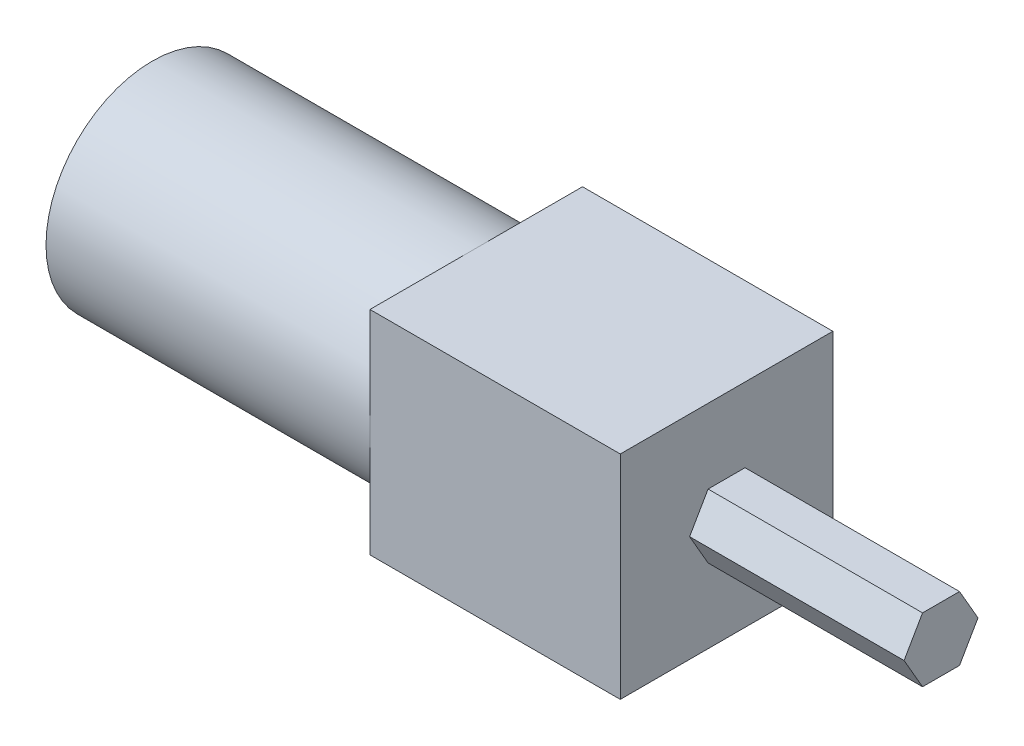
ISO-10303-21;
HEADER;
FILE_DESCRIPTION(('STEP AP214'),'2;1');
FILE_NAME('part.step','',(''),(''),'','','');
FILE_SCHEMA(('AUTOMOTIVE_DESIGN { 1 0 10303 214 1 1 1 1 }'));
ENDSEC;
DATA;
#1=APPLICATION_CONTEXT('core data for automotive mechanical design processes');
#2=APPLICATION_PROTOCOL_DEFINITION('international standard','automotive_design',2000,#1);
#3=PRODUCT_CONTEXT('',#1,'mechanical');
#4=PRODUCT('Part','Part','',(#3));
#5=PRODUCT_RELATED_PRODUCT_CATEGORY('part','',(#4));
#6=PRODUCT_DEFINITION_FORMATION('','',#4);
#7=PRODUCT_DEFINITION_CONTEXT('part definition',#1,'design');
#8=PRODUCT_DEFINITION('design','',#6,#7);
#9=PRODUCT_DEFINITION_SHAPE('','',#8);
#10=(LENGTH_UNIT() NAMED_UNIT(*) SI_UNIT(.MILLI.,.METRE.));
#11=(NAMED_UNIT(*) PLANE_ANGLE_UNIT() SI_UNIT($,.RADIAN.));
#12=(NAMED_UNIT(*) SI_UNIT($,.STERADIAN.) SOLID_ANGLE_UNIT());
#13=UNCERTAINTY_MEASURE_WITH_UNIT(LENGTH_MEASURE(1.E-05),#10,'distance_accuracy_value','');
#14=(GEOMETRIC_REPRESENTATION_CONTEXT(3) GLOBAL_UNCERTAINTY_ASSIGNED_CONTEXT((#13)) GLOBAL_UNIT_ASSIGNED_CONTEXT((#10,
#11,#12)) REPRESENTATION_CONTEXT('',''));
#15=CARTESIAN_POINT('',(0.,0.,0.));
#16=DIRECTION('',(0.,0.,1.));
#17=DIRECTION('',(1.,0.,0.));
#18=AXIS2_PLACEMENT_3D('',#15,#16,#17);
#19=CARTESIAN_POINT('',(113.919,0.,0.));
#20=DIRECTION('',(-1.,0.,0.));
#21=DIRECTION('',(0.,0.,1.));
#22=AXIS2_PLACEMENT_3D('',#19,#20,#21);
#23=PLANE('',#22);
#24=DIRECTION('',(0.,1.,0.));
#25=VECTOR('',#24,1.);
#26=CARTESIAN_POINT('',(113.919,-21.082,-21.082));
#27=LINE('',#26,#25);
#28=CARTESIAN_POINT('',(113.919,-21.082,-21.082));
#29=VERTEX_POINT('',#28);
#30=CARTESIAN_POINT('',(113.919,21.082,-21.082));
#31=VERTEX_POINT('',#30);
#32=EDGE_CURVE('E153',#29,#31,#27,.T.);
#33=ORIENTED_EDGE('',*,*,#32,.T.);
#34=DIRECTION('',(0.,0.,1.));
#35=VECTOR('',#34,1.);
#36=CARTESIAN_POINT('',(113.919,21.082,21.082));
#37=LINE('',#36,#35);
#38=CARTESIAN_POINT('',(113.919,21.082,21.082));
#39=VERTEX_POINT('',#38);
#40=EDGE_CURVE('E156',#31,#39,#37,.T.);
#41=ORIENTED_EDGE('',*,*,#40,.T.);
#42=DIRECTION('',(0.,-1.,0.));
#43=VECTOR('',#42,1.);
#44=CARTESIAN_POINT('',(113.919,-21.082,21.082));
#45=LINE('',#44,#43);
#46=CARTESIAN_POINT('',(113.919,-21.082,21.082));
#47=VERTEX_POINT('',#46);
#48=EDGE_CURVE('E159',#39,#47,#45,.T.);
#49=ORIENTED_EDGE('',*,*,#48,.T.);
#50=DIRECTION('',(0.,0.,-1.));
#51=VECTOR('',#50,1.);
#52=CARTESIAN_POINT('',(113.919,-21.082,21.082));
#53=LINE('',#52,#51);
#54=EDGE_CURVE('E161',#47,#29,#53,.T.);
#55=ORIENTED_EDGE('',*,*,#54,.T.);
#56=EDGE_LOOP('',(#33,#41,#49,#55));
#57=FACE_BOUND('',#56,.T.);
#58=DIRECTION('',(0.,0.866025403784439,-0.5));
#59=VECTOR('',#58,1.);
#60=CARTESIAN_POINT('',(113.919,-6.35,-3.66617420935412));
#61=LINE('',#60,#59);
#62=CARTESIAN_POINT('',(113.919,-6.35,-3.66617420935412));
#63=VERTEX_POINT('',#62);
#64=CARTESIAN_POINT('',(113.919,0.,-7.33234841870825));
#65=VERTEX_POINT('',#64);
#66=EDGE_CURVE('E144',#63,#65,#61,.T.);
#67=ORIENTED_EDGE('',*,*,#66,.F.);
#68=DIRECTION('',(0.,0.,-1.));
#69=VECTOR('',#68,1.);
#70=CARTESIAN_POINT('',(113.919,-6.35,3.66617420935412));
#71=LINE('',#70,#69);
#72=CARTESIAN_POINT('',(113.919,-6.35,3.66617420935412));
#73=VERTEX_POINT('',#72);
#74=EDGE_CURVE('E141',#73,#63,#71,.T.);
#75=ORIENTED_EDGE('',*,*,#74,.F.);
#76=DIRECTION('',(0.,-0.866025403784438,-0.5));
#77=VECTOR('',#76,1.);
#78=CARTESIAN_POINT('',(113.919,0.,7.33234841870825));
#79=LINE('',#78,#77);
#80=CARTESIAN_POINT('',(113.919,0.,7.33234841870825));
#81=VERTEX_POINT('',#80);
#82=EDGE_CURVE('E381',#81,#73,#79,.T.);
#83=ORIENTED_EDGE('',*,*,#82,.F.);
#84=DIRECTION('',(0.,-0.866025403784439,0.5));
#85=VECTOR('',#84,1.);
#86=CARTESIAN_POINT('',(113.919,6.35,3.66617420935412));
#87=LINE('',#86,#85);
#88=CARTESIAN_POINT('',(113.919,6.35,3.66617420935412));
#89=VERTEX_POINT('',#88);
#90=EDGE_CURVE('E396',#89,#81,#87,.T.);
#91=ORIENTED_EDGE('',*,*,#90,.F.);
#92=DIRECTION('',(0.,0.,1.));
#93=VECTOR('',#92,1.);
#94=CARTESIAN_POINT('',(113.919,6.35,-3.66617420935412));
#95=LINE('',#94,#93);
#96=CARTESIAN_POINT('',(113.919,6.35,-3.66617420935412));
#97=VERTEX_POINT('',#96);
#98=EDGE_CURVE('E55',#97,#89,#95,.T.);
#99=ORIENTED_EDGE('',*,*,#98,.F.);
#100=DIRECTION('',(0.,0.866025403784438,0.5));
#101=VECTOR('',#100,1.);
#102=CARTESIAN_POINT('',(113.919,0.,-7.33234841870825));
#103=LINE('',#102,#101);
#104=EDGE_CURVE('E50',#65,#97,#103,.T.);
#105=ORIENTED_EDGE('',*,*,#104,.F.);
#106=EDGE_LOOP('',(#67,#75,#83,#91,#99,#105));
#107=FACE_BOUND('',#106,.T.);
#108=ADVANCED_FACE('F33',(#57,#107),#23,.F.);
#109=CARTESIAN_POINT('',(64.262,0.,0.));
#110=DIRECTION('',(-1.,0.,0.));
#111=DIRECTION('',(0.,0.,1.));
#112=AXIS2_PLACEMENT_3D('',#109,#110,#111);
#113=CYLINDRICAL_SURFACE('',#112,21.082);
#114=CARTESIAN_POINT('',(64.262,0.,0.));
#115=DIRECTION('',(1.,0.,0.));
#116=DIRECTION('',(0.,0.,-1.));
#117=AXIS2_PLACEMENT_3D('',#114,#115,#116);
#118=CIRCLE('',#117,21.082);
#119=CARTESIAN_POINT('',(64.262,0.,-21.082));
#120=VERTEX_POINT('',#119);
#121=CARTESIAN_POINT('',(64.262,21.082,0.));
#122=VERTEX_POINT('',#121);
#123=EDGE_CURVE('E11',#120,#122,#118,.T.);
#124=ORIENTED_EDGE('',*,*,#123,.F.);
#125=CARTESIAN_POINT('',(64.262,-21.082,0.));
#126=VERTEX_POINT('',#125);
#127=EDGE_CURVE('E43',#126,#120,#118,.T.);
#128=ORIENTED_EDGE('',*,*,#127,.F.);
#129=CARTESIAN_POINT('',(64.262,0.,21.082));
#130=VERTEX_POINT('',#129);
#131=EDGE_CURVE('E192',#130,#126,#118,.T.);
#132=ORIENTED_EDGE('',*,*,#131,.F.);
#133=EDGE_CURVE('E42',#122,#130,#118,.T.);
#134=ORIENTED_EDGE('',*,*,#133,.F.);
#135=EDGE_LOOP('',(#124,#128,#132,#134));
#136=FACE_BOUND('',#135,.T.);
#137=CARTESIAN_POINT('',(0.,0.,0.));
#138=DIRECTION('',(1.,0.,0.));
#139=DIRECTION('',(0.,0.,-1.));
#140=AXIS2_PLACEMENT_3D('',#137,#138,#139);
#141=CIRCLE('',#140,21.082);
#142=CARTESIAN_POINT('',(0.,0.,-21.082));
#143=VERTEX_POINT('',#142);
#144=EDGE_CURVE('E37',#143,#143,#141,.T.);
#145=ORIENTED_EDGE('',*,*,#144,.T.);
#146=EDGE_LOOP('',(#145));
#147=FACE_BOUND('',#146,.T.);
#148=ADVANCED_FACE('F35',(#136,#147),#113,.T.);
#149=CARTESIAN_POINT('',(0.,0.,0.));
#150=DIRECTION('',(1.,0.,0.));
#151=DIRECTION('',(0.,0.,-1.));
#152=AXIS2_PLACEMENT_3D('',#149,#150,#151);
#153=PLANE('',#152);
#154=ORIENTED_EDGE('',*,*,#144,.F.);
#155=EDGE_LOOP('',(#154));
#156=FACE_BOUND('',#155,.T.);
#157=ADVANCED_FACE('F218',(#156),#153,.F.);
#158=CARTESIAN_POINT('',(64.262,0.,0.));
#159=DIRECTION('',(-1.,0.,0.));
#160=DIRECTION('',(0.,0.,1.));
#161=AXIS2_PLACEMENT_3D('',#158,#159,#160);
#162=PLANE('',#161);
#163=DIRECTION('',(0.,1.,0.));
#164=VECTOR('',#163,1.);
#165=CARTESIAN_POINT('',(64.262,-21.082,-21.082));
#166=LINE('',#165,#164);
#167=CARTESIAN_POINT('',(64.262,21.082,-21.082));
#168=VERTEX_POINT('',#167);
#169=EDGE_CURVE('E145',#120,#168,#166,.T.);
#170=ORIENTED_EDGE('',*,*,#169,.F.);
#171=ORIENTED_EDGE('',*,*,#123,.T.);
#172=DIRECTION('',(0.,0.,1.));
#173=VECTOR('',#172,1.);
#174=CARTESIAN_POINT('',(64.262,21.082,21.082));
#175=LINE('',#174,#173);
#176=EDGE_CURVE('E166',#168,#122,#175,.T.);
#177=ORIENTED_EDGE('',*,*,#176,.F.);
#178=EDGE_LOOP('',(#170,#171,#177));
#179=FACE_BOUND('',#178,.T.);
#180=ADVANCED_FACE('F216',(#179),#162,.T.);
#181=CARTESIAN_POINT('',(64.262,21.082,21.082));
#182=VERTEX_POINT('',#181);
#183=EDGE_CURVE('E165',#122,#182,#175,.T.);
#184=ORIENTED_EDGE('',*,*,#183,.F.);
#185=ORIENTED_EDGE('',*,*,#133,.T.);
#186=DIRECTION('',(0.,-1.,0.));
#187=VECTOR('',#186,1.);
#188=CARTESIAN_POINT('',(64.262,-21.082,21.082));
#189=LINE('',#188,#187);
#190=EDGE_CURVE('E170',#182,#130,#189,.T.);
#191=ORIENTED_EDGE('',*,*,#190,.F.);
#192=EDGE_LOOP('',(#184,#185,#191));
#193=FACE_BOUND('',#192,.T.);
#194=ADVANCED_FACE('F205',(#193),#162,.T.);
#195=CARTESIAN_POINT('',(64.262,-21.082,21.082));
#196=VERTEX_POINT('',#195);
#197=EDGE_CURVE('E169',#130,#196,#189,.T.);
#198=ORIENTED_EDGE('',*,*,#197,.F.);
#199=ORIENTED_EDGE('',*,*,#131,.T.);
#200=DIRECTION('',(0.,0.,-1.));
#201=VECTOR('',#200,1.);
#202=CARTESIAN_POINT('',(64.262,-21.082,21.082));
#203=LINE('',#202,#201);
#204=EDGE_CURVE('E157',#196,#126,#203,.T.);
#205=ORIENTED_EDGE('',*,*,#204,.F.);
#206=EDGE_LOOP('',(#198,#199,#205));
#207=FACE_BOUND('',#206,.T.);
#208=ADVANCED_FACE('F207',(#207),#162,.T.);
#209=CARTESIAN_POINT('',(113.919,-21.082,-21.082));
#210=DIRECTION('',(0.,0.,1.));
#211=DIRECTION('',(1.,0.,0.));
#212=AXIS2_PLACEMENT_3D('',#209,#210,#211);
#213=PLANE('',#212);
#214=CARTESIAN_POINT('',(64.262,-21.082,-21.082));
#215=VERTEX_POINT('',#214);
#216=EDGE_CURVE('E147',#215,#120,#166,.T.);
#217=ORIENTED_EDGE('',*,*,#216,.T.);
#218=ORIENTED_EDGE('',*,*,#169,.T.);
#219=DIRECTION('',(-1.,0.,0.));
#220=VECTOR('',#219,1.);
#221=CARTESIAN_POINT('',(113.919,21.082,-21.082));
#222=LINE('',#221,#220);
#223=EDGE_CURVE('E184',#31,#168,#222,.T.);
#224=ORIENTED_EDGE('',*,*,#223,.F.);
#225=ORIENTED_EDGE('',*,*,#32,.F.);
#226=DIRECTION('',(-1.,0.,0.));
#227=VECTOR('',#226,1.);
#228=CARTESIAN_POINT('',(113.919,-21.082,-21.082));
#229=LINE('',#228,#227);
#230=EDGE_CURVE('E162',#29,#215,#229,.T.);
#231=ORIENTED_EDGE('',*,*,#230,.T.);
#232=EDGE_LOOP('',(#217,#218,#224,#225,#231));
#233=FACE_BOUND('',#232,.T.);
#234=ADVANCED_FACE('F242',(#233),#213,.F.);
#235=CARTESIAN_POINT('',(113.919,21.082,21.082));
#236=DIRECTION('',(0.,-1.,0.));
#237=DIRECTION('',(0.,0.,-1.));
#238=AXIS2_PLACEMENT_3D('',#235,#236,#237);
#239=PLANE('',#238);
#240=ORIENTED_EDGE('',*,*,#176,.T.);
#241=ORIENTED_EDGE('',*,*,#183,.T.);
#242=DIRECTION('',(-1.,0.,0.));
#243=VECTOR('',#242,1.);
#244=CARTESIAN_POINT('',(113.919,21.082,21.082));
#245=LINE('',#244,#243);
#246=EDGE_CURVE('E181',#39,#182,#245,.T.);
#247=ORIENTED_EDGE('',*,*,#246,.F.);
#248=ORIENTED_EDGE('',*,*,#40,.F.);
#249=ORIENTED_EDGE('',*,*,#223,.T.);
#250=EDGE_LOOP('',(#240,#241,#247,#248,#249));
#251=FACE_BOUND('',#250,.T.);
#252=ADVANCED_FACE('F213',(#251),#239,.F.);
#253=CARTESIAN_POINT('',(113.919,-21.082,21.082));
#254=DIRECTION('',(0.,0.,-1.));
#255=DIRECTION('',(-1.,0.,0.));
#256=AXIS2_PLACEMENT_3D('',#253,#254,#255);
#257=PLANE('',#256);
#258=ORIENTED_EDGE('',*,*,#190,.T.);
#259=ORIENTED_EDGE('',*,*,#197,.T.);
#260=DIRECTION('',(-1.,0.,0.));
#261=VECTOR('',#260,1.);
#262=CARTESIAN_POINT('',(113.919,-21.082,21.082));
#263=LINE('',#262,#261);
#264=EDGE_CURVE('E178',#47,#196,#263,.T.);
#265=ORIENTED_EDGE('',*,*,#264,.F.);
#266=ORIENTED_EDGE('',*,*,#48,.F.);
#267=ORIENTED_EDGE('',*,*,#246,.T.);
#268=EDGE_LOOP('',(#258,#259,#265,#266,#267));
#269=FACE_BOUND('',#268,.T.);
#270=ADVANCED_FACE('F210',(#269),#257,.F.);
#271=CARTESIAN_POINT('',(113.919,-21.082,21.082));
#272=DIRECTION('',(0.,1.,0.));
#273=DIRECTION('',(0.,0.,1.));
#274=AXIS2_PLACEMENT_3D('',#271,#272,#273);
#275=PLANE('',#274);
#276=ORIENTED_EDGE('',*,*,#204,.T.);
#277=EDGE_CURVE('E173',#126,#215,#203,.T.);
#278=ORIENTED_EDGE('',*,*,#277,.T.);
#279=ORIENTED_EDGE('',*,*,#230,.F.);
#280=ORIENTED_EDGE('',*,*,#54,.F.);
#281=ORIENTED_EDGE('',*,*,#264,.T.);
#282=EDGE_LOOP('',(#276,#278,#279,#280,#281));
#283=FACE_BOUND('',#282,.T.);
#284=ADVANCED_FACE('F234',(#283),#275,.F.);
#285=ORIENTED_EDGE('',*,*,#277,.F.);
#286=ORIENTED_EDGE('',*,*,#127,.T.);
#287=ORIENTED_EDGE('',*,*,#216,.F.);
#288=EDGE_LOOP('',(#285,#286,#287));
#289=FACE_BOUND('',#288,.T.);
#290=ADVANCED_FACE('F231',(#289),#162,.T.);
#291=CARTESIAN_POINT('',(156.464,-6.35,-3.66617420935412));
#292=DIRECTION('',(0.,0.5,0.866025403784439));
#293=DIRECTION('',(0.,-0.866025403784439,0.5));
#294=AXIS2_PLACEMENT_3D('',#291,#292,#293);
#295=PLANE('',#294);
#296=ORIENTED_EDGE('',*,*,#66,.T.);
#297=DIRECTION('',(-1.,0.,0.));
#298=VECTOR('',#297,1.);
#299=CARTESIAN_POINT('',(156.464,0.,-7.33234841870825));
#300=LINE('',#299,#298);
#301=CARTESIAN_POINT('',(156.464,0.,-7.33234841870825));
#302=VERTEX_POINT('',#301);
#303=EDGE_CURVE('E125',#302,#65,#300,.T.);
#304=ORIENTED_EDGE('',*,*,#303,.F.);
#305=DIRECTION('',(0.,0.866025403784439,-0.5));
#306=VECTOR('',#305,1.);
#307=CARTESIAN_POINT('',(156.464,-6.35,-3.66617420935412));
#308=LINE('',#307,#306);
#309=CARTESIAN_POINT('',(156.464,-6.35,-3.66617420935412));
#310=VERTEX_POINT('',#309);
#311=EDGE_CURVE('E132',#310,#302,#308,.T.);
#312=ORIENTED_EDGE('',*,*,#311,.F.);
#313=DIRECTION('',(-1.,0.,0.));
#314=VECTOR('',#313,1.);
#315=CARTESIAN_POINT('',(156.464,-6.35,-3.66617420935412));
#316=LINE('',#315,#314);
#317=EDGE_CURVE('E377',#310,#63,#316,.T.);
#318=ORIENTED_EDGE('',*,*,#317,.T.);
#319=EDGE_LOOP('',(#296,#304,#312,#318));
#320=FACE_BOUND('',#319,.T.);
#321=ADVANCED_FACE('F143',(#320),#295,.F.);
#322=CARTESIAN_POINT('',(156.464,0.,-7.33234841870825));
#323=DIRECTION('',(0.,-0.5,0.866025403784438));
#324=DIRECTION('',(0.,-0.866025403784438,-0.5));
#325=AXIS2_PLACEMENT_3D('',#322,#323,#324);
#326=PLANE('',#325);
#327=ORIENTED_EDGE('',*,*,#104,.T.);
#328=DIRECTION('',(-1.,0.,0.));
#329=VECTOR('',#328,1.);
#330=CARTESIAN_POINT('',(156.464,6.35,-3.66617420935412));
#331=LINE('',#330,#329);
#332=CARTESIAN_POINT('',(156.464,6.35,-3.66617420935412));
#333=VERTEX_POINT('',#332);
#334=EDGE_CURVE('E128',#333,#97,#331,.T.);
#335=ORIENTED_EDGE('',*,*,#334,.F.);
#336=DIRECTION('',(0.,0.866025403784438,0.5));
#337=VECTOR('',#336,1.);
#338=CARTESIAN_POINT('',(156.464,0.,-7.33234841870825));
#339=LINE('',#338,#337);
#340=EDGE_CURVE('E121',#302,#333,#339,.T.);
#341=ORIENTED_EDGE('',*,*,#340,.F.);
#342=ORIENTED_EDGE('',*,*,#303,.T.);
#343=EDGE_LOOP('',(#327,#335,#341,#342));
#344=FACE_BOUND('',#343,.T.);
#345=ADVANCED_FACE('F123',(#344),#326,.F.);
#346=CARTESIAN_POINT('',(156.464,6.35,-3.66617420935412));
#347=DIRECTION('',(0.,-1.,0.));
#348=DIRECTION('',(0.,0.,-1.));
#349=AXIS2_PLACEMENT_3D('',#346,#347,#348);
#350=PLANE('',#349);
#351=ORIENTED_EDGE('',*,*,#98,.T.);
#352=DIRECTION('',(-1.,0.,0.));
#353=VECTOR('',#352,1.);
#354=CARTESIAN_POINT('',(156.464,6.35,3.66617420935412));
#355=LINE('',#354,#353);
#356=CARTESIAN_POINT('',(156.464,6.35,3.66617420935412));
#357=VERTEX_POINT('',#356);
#358=EDGE_CURVE('E149',#357,#89,#355,.T.);
#359=ORIENTED_EDGE('',*,*,#358,.F.);
#360=DIRECTION('',(0.,0.,1.));
#361=VECTOR('',#360,1.);
#362=CARTESIAN_POINT('',(156.464,6.35,-3.66617420935412));
#363=LINE('',#362,#361);
#364=EDGE_CURVE('E131',#333,#357,#363,.T.);
#365=ORIENTED_EDGE('',*,*,#364,.F.);
#366=ORIENTED_EDGE('',*,*,#334,.T.);
#367=EDGE_LOOP('',(#351,#359,#365,#366));
#368=FACE_BOUND('',#367,.T.);
#369=ADVANCED_FACE('F321',(#368),#350,.F.);
#370=CARTESIAN_POINT('',(156.464,6.35,3.66617420935412));
#371=DIRECTION('',(0.,-0.5,-0.866025403784439));
#372=DIRECTION('',(0.,0.866025403784439,-0.5));
#373=AXIS2_PLACEMENT_3D('',#370,#371,#372);
#374=PLANE('',#373);
#375=ORIENTED_EDGE('',*,*,#90,.T.);
#376=DIRECTION('',(-1.,0.,0.));
#377=VECTOR('',#376,1.);
#378=CARTESIAN_POINT('',(156.464,0.,7.33234841870825));
#379=LINE('',#378,#377);
#380=CARTESIAN_POINT('',(156.464,0.,7.33234841870825));
#381=VERTEX_POINT('',#380);
#382=EDGE_CURVE('E384',#381,#81,#379,.T.);
#383=ORIENTED_EDGE('',*,*,#382,.F.);
#384=DIRECTION('',(0.,-0.866025403784439,0.5));
#385=VECTOR('',#384,1.);
#386=CARTESIAN_POINT('',(156.464,6.35,3.66617420935412));
#387=LINE('',#386,#385);
#388=EDGE_CURVE('E397',#357,#381,#387,.T.);
#389=ORIENTED_EDGE('',*,*,#388,.F.);
#390=ORIENTED_EDGE('',*,*,#358,.T.);
#391=EDGE_LOOP('',(#375,#383,#389,#390));
#392=FACE_BOUND('',#391,.T.);
#393=ADVANCED_FACE('F328',(#392),#374,.F.);
#394=CARTESIAN_POINT('',(156.464,0.,7.33234841870825));
#395=DIRECTION('',(0.,0.5,-0.866025403784439));
#396=DIRECTION('',(0.,0.866025403784439,0.5));
#397=AXIS2_PLACEMENT_3D('',#394,#395,#396);
#398=PLANE('',#397);
#399=ORIENTED_EDGE('',*,*,#82,.T.);
#400=DIRECTION('',(-1.,0.,0.));
#401=VECTOR('',#400,1.);
#402=CARTESIAN_POINT('',(156.464,-6.35,3.66617420935412));
#403=LINE('',#402,#401);
#404=CARTESIAN_POINT('',(156.464,-6.35,3.66617420935412));
#405=VERTEX_POINT('',#404);
#406=EDGE_CURVE('E379',#405,#73,#403,.T.);
#407=ORIENTED_EDGE('',*,*,#406,.F.);
#408=DIRECTION('',(0.,-0.866025403784438,-0.5));
#409=VECTOR('',#408,1.);
#410=CARTESIAN_POINT('',(156.464,0.,7.33234841870825));
#411=LINE('',#410,#409);
#412=EDGE_CURVE('E386',#381,#405,#411,.T.);
#413=ORIENTED_EDGE('',*,*,#412,.F.);
#414=ORIENTED_EDGE('',*,*,#382,.T.);
#415=EDGE_LOOP('',(#399,#407,#413,#414));
#416=FACE_BOUND('',#415,.T.);
#417=ADVANCED_FACE('F337',(#416),#398,.F.);
#418=CARTESIAN_POINT('',(156.464,-6.35,3.66617420935412));
#419=DIRECTION('',(0.,1.,0.));
#420=DIRECTION('',(0.,0.,1.));
#421=AXIS2_PLACEMENT_3D('',#418,#419,#420);
#422=PLANE('',#421);
#423=ORIENTED_EDGE('',*,*,#74,.T.);
#424=ORIENTED_EDGE('',*,*,#317,.F.);
#425=DIRECTION('',(0.,0.,-1.));
#426=VECTOR('',#425,1.);
#427=CARTESIAN_POINT('',(156.464,-6.35,3.66617420935412));
#428=LINE('',#427,#426);
#429=EDGE_CURVE('E137',#405,#310,#428,.T.);
#430=ORIENTED_EDGE('',*,*,#429,.F.);
#431=ORIENTED_EDGE('',*,*,#406,.T.);
#432=EDGE_LOOP('',(#423,#424,#430,#431));
#433=FACE_BOUND('',#432,.T.);
#434=ADVANCED_FACE('F346',(#433),#422,.F.);
#435=CARTESIAN_POINT('',(156.464,0.,0.));
#436=DIRECTION('',(1.,0.,0.));
#437=DIRECTION('',(0.,0.,-1.));
#438=AXIS2_PLACEMENT_3D('',#435,#436,#437);
#439=PLANE('',#438);
#440=ORIENTED_EDGE('',*,*,#311,.T.);
#441=ORIENTED_EDGE('',*,*,#340,.T.);
#442=ORIENTED_EDGE('',*,*,#364,.T.);
#443=ORIENTED_EDGE('',*,*,#388,.T.);
#444=ORIENTED_EDGE('',*,*,#412,.T.);
#445=ORIENTED_EDGE('',*,*,#429,.T.);
#446=EDGE_LOOP('',(#440,#441,#442,#443,#444,#445));
#447=FACE_BOUND('',#446,.T.);
#448=ADVANCED_FACE('F135',(#447),#439,.T.);
#449=CLOSED_SHELL('',(#108,#148,#157,#180,#194,#208,#234,#252,#270,#284,#290,#321,#345,#369,
#393,#417,#434,#448));
#450=MANIFOLD_SOLID_BREP('B2',#449);
#451=ADVANCED_BREP_SHAPE_REPRESENTATION('',(#18,#450),#14);
#452=SHAPE_DEFINITION_REPRESENTATION(#9,#451);
ENDSEC;
END-ISO-10303-21;
